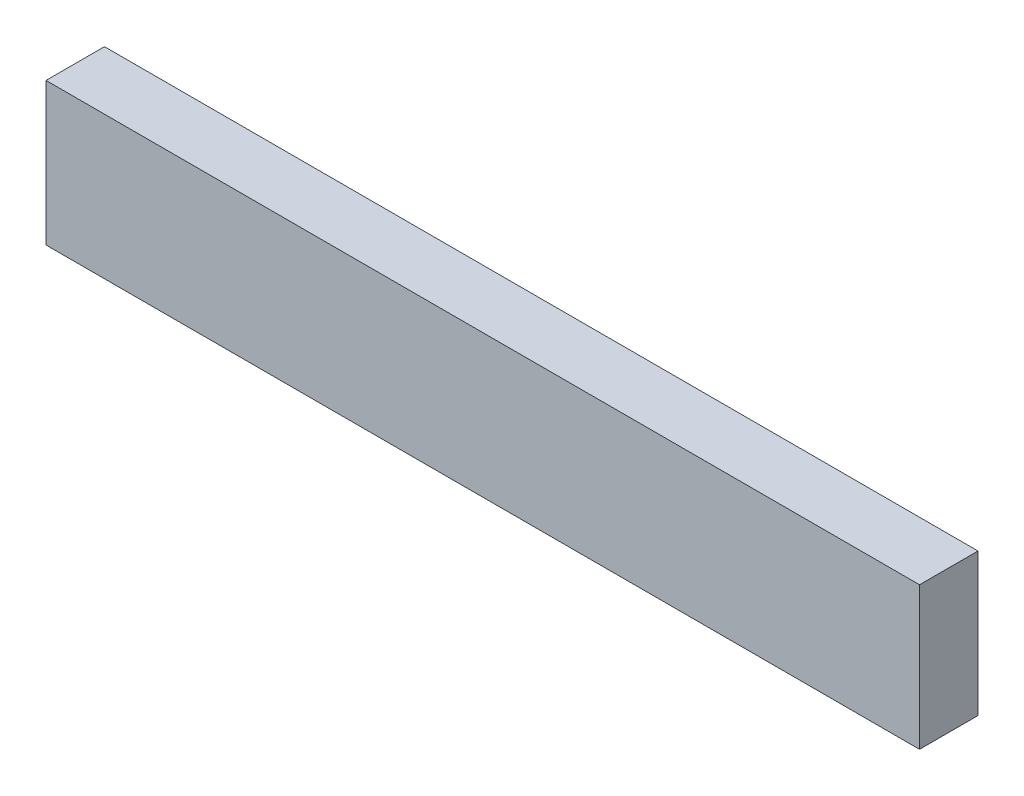
ISO-10303-21;
HEADER;
FILE_DESCRIPTION(('STEP AP214'),'2;1');
FILE_NAME('part.step','',(''),(''),'','','');
FILE_SCHEMA(('AUTOMOTIVE_DESIGN { 1 0 10303 214 1 1 1 1 }'));
ENDSEC;
DATA;
#1=APPLICATION_CONTEXT('core data for automotive mechanical design processes');
#2=APPLICATION_PROTOCOL_DEFINITION('international standard','automotive_design',2000,#1);
#3=PRODUCT_CONTEXT('',#1,'mechanical');
#4=PRODUCT('Part','Part','',(#3));
#5=PRODUCT_RELATED_PRODUCT_CATEGORY('part','',(#4));
#6=PRODUCT_DEFINITION_FORMATION('','',#4);
#7=PRODUCT_DEFINITION_CONTEXT('part definition',#1,'design');
#8=PRODUCT_DEFINITION('design','',#6,#7);
#9=PRODUCT_DEFINITION_SHAPE('','',#8);
#10=(LENGTH_UNIT() NAMED_UNIT(*) SI_UNIT(.MILLI.,.METRE.));
#11=(NAMED_UNIT(*) PLANE_ANGLE_UNIT() SI_UNIT($,.RADIAN.));
#12=(NAMED_UNIT(*) SI_UNIT($,.STERADIAN.) SOLID_ANGLE_UNIT());
#13=UNCERTAINTY_MEASURE_WITH_UNIT(LENGTH_MEASURE(1.E-05),#10,'distance_accuracy_value','');
#14=(GEOMETRIC_REPRESENTATION_CONTEXT(3) GLOBAL_UNCERTAINTY_ASSIGNED_CONTEXT((#13)) GLOBAL_UNIT_ASSIGNED_CONTEXT((#10,
#11,#12)) REPRESENTATION_CONTEXT('',''));
#15=CARTESIAN_POINT('',(0.,0.,0.));
#16=DIRECTION('',(0.,0.,1.));
#17=DIRECTION('',(1.,0.,0.));
#18=AXIS2_PLACEMENT_3D('',#15,#16,#17);
#19=CARTESIAN_POINT('',(23.9,-3.9,3.2));
#20=DIRECTION('',(-1.,0.,0.));
#21=DIRECTION('',(0.,0.,1.));
#22=AXIS2_PLACEMENT_3D('',#19,#20,#21);
#23=PLANE('',#22);
#24=DIRECTION('',(0.,1.,0.));
#25=VECTOR('',#24,1.);
#26=CARTESIAN_POINT('',(23.9,-3.9,0.));
#27=LINE('',#26,#25);
#28=CARTESIAN_POINT('',(23.9,-3.9,0.));
#29=VERTEX_POINT('',#28);
#30=CARTESIAN_POINT('',(23.9,3.9,0.));
#31=VERTEX_POINT('',#30);
#32=EDGE_CURVE('E98',#29,#31,#27,.T.);
#33=ORIENTED_EDGE('',*,*,#32,.T.);
#34=DIRECTION('',(0.,0.,-1.));
#35=VECTOR('',#34,1.);
#36=CARTESIAN_POINT('',(23.9,3.9,3.2));
#37=LINE('',#36,#35);
#38=CARTESIAN_POINT('',(23.9,3.9,3.2));
#39=VERTEX_POINT('',#38);
#40=EDGE_CURVE('E11',#39,#31,#37,.T.);
#41=ORIENTED_EDGE('',*,*,#40,.F.);
#42=DIRECTION('',(0.,1.,0.));
#43=VECTOR('',#42,1.);
#44=CARTESIAN_POINT('',(23.9,-3.9,3.2));
#45=LINE('',#44,#43);
#46=CARTESIAN_POINT('',(23.9,-3.9,3.2));
#47=VERTEX_POINT('',#46);
#48=EDGE_CURVE('E86',#47,#39,#45,.T.);
#49=ORIENTED_EDGE('',*,*,#48,.F.);
#50=DIRECTION('',(0.,0.,-1.));
#51=VECTOR('',#50,1.);
#52=CARTESIAN_POINT('',(23.9,-3.9,3.2));
#53=LINE('',#52,#51);
#54=EDGE_CURVE('E94',#47,#29,#53,.T.);
#55=ORIENTED_EDGE('',*,*,#54,.T.);
#56=EDGE_LOOP('',(#33,#41,#49,#55));
#57=FACE_BOUND('',#56,.T.);
#58=ADVANCED_FACE('F35',(#57),#23,.F.);
#59=CARTESIAN_POINT('',(-23.9,3.9,3.2));
#60=DIRECTION('',(0.,-1.,0.));
#61=DIRECTION('',(0.,0.,-1.));
#62=AXIS2_PLACEMENT_3D('',#59,#60,#61);
#63=PLANE('',#62);
#64=DIRECTION('',(-1.,0.,0.));
#65=VECTOR('',#64,1.);
#66=CARTESIAN_POINT('',(-23.9,3.9,0.));
#67=LINE('',#66,#65);
#68=CARTESIAN_POINT('',(-23.9,3.9,0.));
#69=VERTEX_POINT('',#68);
#70=EDGE_CURVE('E90',#31,#69,#67,.T.);
#71=ORIENTED_EDGE('',*,*,#70,.T.);
#72=DIRECTION('',(0.,0.,-1.));
#73=VECTOR('',#72,1.);
#74=CARTESIAN_POINT('',(-23.9,3.9,3.2));
#75=LINE('',#74,#73);
#76=CARTESIAN_POINT('',(-23.9,3.9,3.2));
#77=VERTEX_POINT('',#76);
#78=EDGE_CURVE('E43',#77,#69,#75,.T.);
#79=ORIENTED_EDGE('',*,*,#78,.F.);
#80=DIRECTION('',(-1.,0.,0.));
#81=VECTOR('',#80,1.);
#82=CARTESIAN_POINT('',(-23.9,3.9,3.2));
#83=LINE('',#82,#81);
#84=EDGE_CURVE('E81',#39,#77,#83,.T.);
#85=ORIENTED_EDGE('',*,*,#84,.F.);
#86=ORIENTED_EDGE('',*,*,#40,.T.);
#87=EDGE_LOOP('',(#71,#79,#85,#86));
#88=FACE_BOUND('',#87,.T.);
#89=ADVANCED_FACE('F89',(#88),#63,.F.);
#90=CARTESIAN_POINT('',(-23.9,-3.9,3.2));
#91=DIRECTION('',(1.,0.,0.));
#92=DIRECTION('',(0.,0.,-1.));
#93=AXIS2_PLACEMENT_3D('',#90,#91,#92);
#94=PLANE('',#93);
#95=DIRECTION('',(0.,-1.,0.));
#96=VECTOR('',#95,1.);
#97=CARTESIAN_POINT('',(-23.9,-3.9,0.));
#98=LINE('',#97,#96);
#99=CARTESIAN_POINT('',(-23.9,-3.9,0.));
#100=VERTEX_POINT('',#99);
#101=EDGE_CURVE('E68',#69,#100,#98,.T.);
#102=ORIENTED_EDGE('',*,*,#101,.T.);
#103=DIRECTION('',(0.,0.,-1.));
#104=VECTOR('',#103,1.);
#105=CARTESIAN_POINT('',(-23.9,-3.9,3.2));
#106=LINE('',#105,#104);
#107=CARTESIAN_POINT('',(-23.9,-3.9,3.2));
#108=VERTEX_POINT('',#107);
#109=EDGE_CURVE('E91',#108,#100,#106,.T.);
#110=ORIENTED_EDGE('',*,*,#109,.F.);
#111=DIRECTION('',(0.,-1.,0.));
#112=VECTOR('',#111,1.);
#113=CARTESIAN_POINT('',(-23.9,-3.9,3.2));
#114=LINE('',#113,#112);
#115=EDGE_CURVE('E84',#77,#108,#114,.T.);
#116=ORIENTED_EDGE('',*,*,#115,.F.);
#117=ORIENTED_EDGE('',*,*,#78,.T.);
#118=EDGE_LOOP('',(#102,#110,#116,#117));
#119=FACE_BOUND('',#118,.T.);
#120=ADVANCED_FACE('F92',(#119),#94,.F.);
#121=CARTESIAN_POINT('',(-23.9,-3.9,3.2));
#122=DIRECTION('',(0.,1.,0.));
#123=DIRECTION('',(0.,0.,1.));
#124=AXIS2_PLACEMENT_3D('',#121,#122,#123);
#125=PLANE('',#124);
#126=DIRECTION('',(1.,0.,0.));
#127=VECTOR('',#126,1.);
#128=CARTESIAN_POINT('',(-23.9,-3.9,0.));
#129=LINE('',#128,#127);
#130=EDGE_CURVE('E74',#100,#29,#129,.T.);
#131=ORIENTED_EDGE('',*,*,#130,.T.);
#132=ORIENTED_EDGE('',*,*,#54,.F.);
#133=DIRECTION('',(1.,0.,0.));
#134=VECTOR('',#133,1.);
#135=CARTESIAN_POINT('',(-23.9,-3.9,3.2));
#136=LINE('',#135,#134);
#137=EDGE_CURVE('E51',#108,#47,#136,.T.);
#138=ORIENTED_EDGE('',*,*,#137,.F.);
#139=ORIENTED_EDGE('',*,*,#109,.T.);
#140=EDGE_LOOP('',(#131,#132,#138,#139));
#141=FACE_BOUND('',#140,.T.);
#142=ADVANCED_FACE('F106',(#141),#125,.F.);
#143=CARTESIAN_POINT('',(0.,0.,3.2));
#144=DIRECTION('',(0.,0.,-1.));
#145=DIRECTION('',(-1.,0.,0.));
#146=AXIS2_PLACEMENT_3D('',#143,#144,#145);
#147=PLANE('',#146);
#148=ORIENTED_EDGE('',*,*,#48,.T.);
#149=ORIENTED_EDGE('',*,*,#84,.T.);
#150=ORIENTED_EDGE('',*,*,#115,.T.);
#151=ORIENTED_EDGE('',*,*,#137,.T.);
#152=EDGE_LOOP('',(#148,#149,#150,#151));
#153=FACE_BOUND('',#152,.T.);
#154=ADVANCED_FACE('F82',(#153),#147,.F.);
#155=CARTESIAN_POINT('',(0.,0.,0.));
#156=DIRECTION('',(0.,0.,-1.));
#157=DIRECTION('',(-1.,0.,0.));
#158=AXIS2_PLACEMENT_3D('',#155,#156,#157);
#159=PLANE('',#158);
#160=CARTESIAN_POINT('',(-19.5084584107223,0.,0.));
#161=DIRECTION('',(0.,0.,-1.));
#162=DIRECTION('',(-1.,0.,0.));
#163=AXIS2_PLACEMENT_3D('',#160,#161,#162);
#164=CIRCLE('',#163,2.5);
#165=CARTESIAN_POINT('',(-22.0084584107223,0.,0.));
#166=VERTEX_POINT('',#165);
#167=EDGE_CURVE('E142',#166,#166,#164,.T.);
#168=ORIENTED_EDGE('',*,*,#167,.F.);
#169=EDGE_LOOP('',(#168));
#170=FACE_BOUND('',#169,.T.);
#171=CARTESIAN_POINT('',(-11.5084584107223,0.,0.));
#172=DIRECTION('',(0.,0.,-1.));
#173=DIRECTION('',(-1.,0.,0.));
#174=AXIS2_PLACEMENT_3D('',#171,#172,#173);
#175=CIRCLE('',#174,2.5);
#176=CARTESIAN_POINT('',(-14.0084584107223,0.,0.));
#177=VERTEX_POINT('',#176);
#178=EDGE_CURVE('E136',#177,#177,#175,.T.);
#179=ORIENTED_EDGE('',*,*,#178,.F.);
#180=EDGE_LOOP('',(#179));
#181=FACE_BOUND('',#180,.T.);
#182=CARTESIAN_POINT('',(-3.50845841072235,0.,0.));
#183=DIRECTION('',(0.,0.,-1.));
#184=DIRECTION('',(-1.,0.,0.));
#185=AXIS2_PLACEMENT_3D('',#182,#183,#184);
#186=CIRCLE('',#185,2.5);
#187=CARTESIAN_POINT('',(-6.00845841072235,0.,0.));
#188=VERTEX_POINT('',#187);
#189=EDGE_CURVE('E130',#188,#188,#186,.T.);
#190=ORIENTED_EDGE('',*,*,#189,.F.);
#191=EDGE_LOOP('',(#190));
#192=FACE_BOUND('',#191,.T.);
#193=CARTESIAN_POINT('',(4.49154158927765,0.,0.));
#194=DIRECTION('',(0.,0.,-1.));
#195=DIRECTION('',(-1.,0.,0.));
#196=AXIS2_PLACEMENT_3D('',#193,#194,#195);
#197=CIRCLE('',#196,2.5);
#198=CARTESIAN_POINT('',(1.99154158927765,0.,0.));
#199=VERTEX_POINT('',#198);
#200=EDGE_CURVE('E124',#199,#199,#197,.T.);
#201=ORIENTED_EDGE('',*,*,#200,.F.);
#202=EDGE_LOOP('',(#201));
#203=FACE_BOUND('',#202,.T.);
#204=CARTESIAN_POINT('',(12.4915415892777,0.,0.));
#205=DIRECTION('',(0.,0.,-1.));
#206=DIRECTION('',(-1.,0.,0.));
#207=AXIS2_PLACEMENT_3D('',#204,#205,#206);
#208=CIRCLE('',#207,2.5);
#209=CARTESIAN_POINT('',(9.99154158927765,0.,0.));
#210=VERTEX_POINT('',#209);
#211=EDGE_CURVE('E118',#210,#210,#208,.T.);
#212=ORIENTED_EDGE('',*,*,#211,.F.);
#213=EDGE_LOOP('',(#212));
#214=FACE_BOUND('',#213,.T.);
#215=CARTESIAN_POINT('',(20.4915415892777,0.,0.));
#216=DIRECTION('',(0.,0.,-1.));
#217=DIRECTION('',(-1.,0.,0.));
#218=AXIS2_PLACEMENT_3D('',#215,#216,#217);
#219=CIRCLE('',#218,2.5);
#220=CARTESIAN_POINT('',(17.9915415892777,0.,0.));
#221=VERTEX_POINT('',#220);
#222=EDGE_CURVE('E112',#221,#221,#219,.T.);
#223=ORIENTED_EDGE('',*,*,#222,.F.);
#224=EDGE_LOOP('',(#223));
#225=FACE_BOUND('',#224,.T.);
#226=ORIENTED_EDGE('',*,*,#32,.F.);
#227=ORIENTED_EDGE('',*,*,#130,.F.);
#228=ORIENTED_EDGE('',*,*,#101,.F.);
#229=ORIENTED_EDGE('',*,*,#70,.F.);
#230=EDGE_LOOP('',(#226,#227,#228,#229));
#231=FACE_BOUND('',#230,.T.);
#232=ADVANCED_FACE('F109',(#170,#181,#192,#203,#214,#225,#231),#159,.T.);
#233=CARTESIAN_POINT('',(20.4915415892777,0.,1.8));
#234=DIRECTION('',(0.,0.,-1.));
#235=DIRECTION('',(-1.,0.,0.));
#236=AXIS2_PLACEMENT_3D('',#233,#234,#235);
#237=CYLINDRICAL_SURFACE('',#236,2.5);
#238=CARTESIAN_POINT('',(20.4915415892777,0.,1.8));
#239=DIRECTION('',(0.,0.,-1.));
#240=DIRECTION('',(-1.,0.,0.));
#241=AXIS2_PLACEMENT_3D('',#238,#239,#240);
#242=CIRCLE('',#241,2.5);
#243=CARTESIAN_POINT('',(17.9915415892777,0.,1.8));
#244=VERTEX_POINT('',#243);
#245=EDGE_CURVE('E101',#244,#244,#242,.T.);
#246=ORIENTED_EDGE('',*,*,#245,.F.);
#247=EDGE_LOOP('',(#246));
#248=FACE_BOUND('',#247,.T.);
#249=ORIENTED_EDGE('',*,*,#222,.T.);
#250=EDGE_LOOP('',(#249));
#251=FACE_BOUND('',#250,.T.);
#252=ADVANCED_FACE('F159',(#248,#251),#237,.F.);
#253=CARTESIAN_POINT('',(20.4915415892777,0.,1.8));
#254=DIRECTION('',(0.,0.,-1.));
#255=DIRECTION('',(-1.,0.,0.));
#256=AXIS2_PLACEMENT_3D('',#253,#254,#255);
#257=PLANE('',#256);
#258=ORIENTED_EDGE('',*,*,#245,.T.);
#259=EDGE_LOOP('',(#258));
#260=FACE_BOUND('',#259,.T.);
#261=ADVANCED_FACE('F172',(#260),#257,.T.);
#262=CARTESIAN_POINT('',(12.4915415892777,0.,1.8));
#263=DIRECTION('',(0.,0.,-1.));
#264=DIRECTION('',(-1.,0.,0.));
#265=AXIS2_PLACEMENT_3D('',#262,#263,#264);
#266=CYLINDRICAL_SURFACE('',#265,2.5);
#267=CARTESIAN_POINT('',(12.4915415892777,0.,1.8));
#268=DIRECTION('',(0.,0.,-1.));
#269=DIRECTION('',(-1.,0.,0.));
#270=AXIS2_PLACEMENT_3D('',#267,#268,#269);
#271=CIRCLE('',#270,2.5);
#272=CARTESIAN_POINT('',(9.99154158927765,0.,1.8));
#273=VERTEX_POINT('',#272);
#274=EDGE_CURVE('E115',#273,#273,#271,.T.);
#275=ORIENTED_EDGE('',*,*,#274,.F.);
#276=EDGE_LOOP('',(#275));
#277=FACE_BOUND('',#276,.T.);
#278=ORIENTED_EDGE('',*,*,#211,.T.);
#279=EDGE_LOOP('',(#278));
#280=FACE_BOUND('',#279,.T.);
#281=ADVANCED_FACE('F178',(#277,#280),#266,.F.);
#282=CARTESIAN_POINT('',(12.4915415892777,0.,1.8));
#283=DIRECTION('',(0.,0.,-1.));
#284=DIRECTION('',(-1.,0.,0.));
#285=AXIS2_PLACEMENT_3D('',#282,#283,#284);
#286=PLANE('',#285);
#287=ORIENTED_EDGE('',*,*,#274,.T.);
#288=EDGE_LOOP('',(#287));
#289=FACE_BOUND('',#288,.T.);
#290=ADVANCED_FACE('F221',(#289),#286,.T.);
#291=CARTESIAN_POINT('',(4.49154158927765,0.,1.8));
#292=DIRECTION('',(0.,0.,-1.));
#293=DIRECTION('',(-1.,0.,0.));
#294=AXIS2_PLACEMENT_3D('',#291,#292,#293);
#295=CYLINDRICAL_SURFACE('',#294,2.5);
#296=CARTESIAN_POINT('',(4.49154158927765,0.,1.8));
#297=DIRECTION('',(0.,0.,-1.));
#298=DIRECTION('',(-1.,0.,0.));
#299=AXIS2_PLACEMENT_3D('',#296,#297,#298);
#300=CIRCLE('',#299,2.5);
#301=CARTESIAN_POINT('',(1.99154158927765,0.,1.8));
#302=VERTEX_POINT('',#301);
#303=EDGE_CURVE('E121',#302,#302,#300,.T.);
#304=ORIENTED_EDGE('',*,*,#303,.F.);
#305=EDGE_LOOP('',(#304));
#306=FACE_BOUND('',#305,.T.);
#307=ORIENTED_EDGE('',*,*,#200,.T.);
#308=EDGE_LOOP('',(#307));
#309=FACE_BOUND('',#308,.T.);
#310=ADVANCED_FACE('F231',(#306,#309),#295,.F.);
#311=CARTESIAN_POINT('',(4.49154158927765,0.,1.8));
#312=DIRECTION('',(0.,0.,-1.));
#313=DIRECTION('',(-1.,0.,0.));
#314=AXIS2_PLACEMENT_3D('',#311,#312,#313);
#315=PLANE('',#314);
#316=ORIENTED_EDGE('',*,*,#303,.T.);
#317=EDGE_LOOP('',(#316));
#318=FACE_BOUND('',#317,.T.);
#319=ADVANCED_FACE('F241',(#318),#315,.T.);
#320=CARTESIAN_POINT('',(-3.50845841072235,0.,1.8));
#321=DIRECTION('',(0.,0.,-1.));
#322=DIRECTION('',(-1.,0.,0.));
#323=AXIS2_PLACEMENT_3D('',#320,#321,#322);
#324=CYLINDRICAL_SURFACE('',#323,2.5);
#325=CARTESIAN_POINT('',(-3.50845841072235,0.,1.8));
#326=DIRECTION('',(0.,0.,-1.));
#327=DIRECTION('',(-1.,0.,0.));
#328=AXIS2_PLACEMENT_3D('',#325,#326,#327);
#329=CIRCLE('',#328,2.5);
#330=CARTESIAN_POINT('',(-6.00845841072235,0.,1.8));
#331=VERTEX_POINT('',#330);
#332=EDGE_CURVE('E127',#331,#331,#329,.T.);
#333=ORIENTED_EDGE('',*,*,#332,.F.);
#334=EDGE_LOOP('',(#333));
#335=FACE_BOUND('',#334,.T.);
#336=ORIENTED_EDGE('',*,*,#189,.T.);
#337=EDGE_LOOP('',(#336));
#338=FACE_BOUND('',#337,.T.);
#339=ADVANCED_FACE('F251',(#335,#338),#324,.F.);
#340=CARTESIAN_POINT('',(-3.50845841072235,0.,1.8));
#341=DIRECTION('',(0.,0.,-1.));
#342=DIRECTION('',(-1.,0.,0.));
#343=AXIS2_PLACEMENT_3D('',#340,#341,#342);
#344=PLANE('',#343);
#345=ORIENTED_EDGE('',*,*,#332,.T.);
#346=EDGE_LOOP('',(#345));
#347=FACE_BOUND('',#346,.T.);
#348=ADVANCED_FACE('F261',(#347),#344,.T.);
#349=CARTESIAN_POINT('',(-11.5084584107223,0.,1.8));
#350=DIRECTION('',(0.,0.,-1.));
#351=DIRECTION('',(-1.,0.,0.));
#352=AXIS2_PLACEMENT_3D('',#349,#350,#351);
#353=CYLINDRICAL_SURFACE('',#352,2.5);
#354=CARTESIAN_POINT('',(-11.5084584107223,0.,1.8));
#355=DIRECTION('',(0.,0.,-1.));
#356=DIRECTION('',(-1.,0.,0.));
#357=AXIS2_PLACEMENT_3D('',#354,#355,#356);
#358=CIRCLE('',#357,2.5);
#359=CARTESIAN_POINT('',(-14.0084584107223,0.,1.8));
#360=VERTEX_POINT('',#359);
#361=EDGE_CURVE('E133',#360,#360,#358,.T.);
#362=ORIENTED_EDGE('',*,*,#361,.F.);
#363=EDGE_LOOP('',(#362));
#364=FACE_BOUND('',#363,.T.);
#365=ORIENTED_EDGE('',*,*,#178,.T.);
#366=EDGE_LOOP('',(#365));
#367=FACE_BOUND('',#366,.T.);
#368=ADVANCED_FACE('F271',(#364,#367),#353,.F.);
#369=CARTESIAN_POINT('',(-11.5084584107223,0.,1.8));
#370=DIRECTION('',(0.,0.,-1.));
#371=DIRECTION('',(-1.,0.,0.));
#372=AXIS2_PLACEMENT_3D('',#369,#370,#371);
#373=PLANE('',#372);
#374=ORIENTED_EDGE('',*,*,#361,.T.);
#375=EDGE_LOOP('',(#374));
#376=FACE_BOUND('',#375,.T.);
#377=ADVANCED_FACE('F153',(#376),#373,.T.);
#378=CARTESIAN_POINT('',(-19.5084584107223,0.,1.8));
#379=DIRECTION('',(0.,0.,-1.));
#380=DIRECTION('',(-1.,0.,0.));
#381=AXIS2_PLACEMENT_3D('',#378,#379,#380);
#382=CYLINDRICAL_SURFACE('',#381,2.5);
#383=CARTESIAN_POINT('',(-19.5084584107223,0.,1.8));
#384=DIRECTION('',(0.,0.,-1.));
#385=DIRECTION('',(-1.,0.,0.));
#386=AXIS2_PLACEMENT_3D('',#383,#384,#385);
#387=CIRCLE('',#386,2.5);
#388=CARTESIAN_POINT('',(-22.0084584107223,0.,1.8));
#389=VERTEX_POINT('',#388);
#390=EDGE_CURVE('E139',#389,#389,#387,.T.);
#391=ORIENTED_EDGE('',*,*,#390,.F.);
#392=EDGE_LOOP('',(#391));
#393=FACE_BOUND('',#392,.T.);
#394=ORIENTED_EDGE('',*,*,#167,.T.);
#395=EDGE_LOOP('',(#394));
#396=FACE_BOUND('',#395,.T.);
#397=ADVANCED_FACE('F150',(#393,#396),#382,.F.);
#398=CARTESIAN_POINT('',(-19.5084584107223,0.,1.8));
#399=DIRECTION('',(0.,0.,-1.));
#400=DIRECTION('',(-1.,0.,0.));
#401=AXIS2_PLACEMENT_3D('',#398,#399,#400);
#402=PLANE('',#401);
#403=ORIENTED_EDGE('',*,*,#390,.T.);
#404=EDGE_LOOP('',(#403));
#405=FACE_BOUND('',#404,.T.);
#406=ADVANCED_FACE('F148',(#405),#402,.T.);
#407=CLOSED_SHELL('',(#58,#89,#120,#142,#154,#232,#252,#261,#281,#290,#310,#319,#339,#348,#368,
#377,#397,#406));
#408=MANIFOLD_SOLID_BREP('B2',#407);
#409=ADVANCED_BREP_SHAPE_REPRESENTATION('',(#18,#408),#14);
#410=SHAPE_DEFINITION_REPRESENTATION(#9,#409);
ENDSEC;
END-ISO-10303-21;
